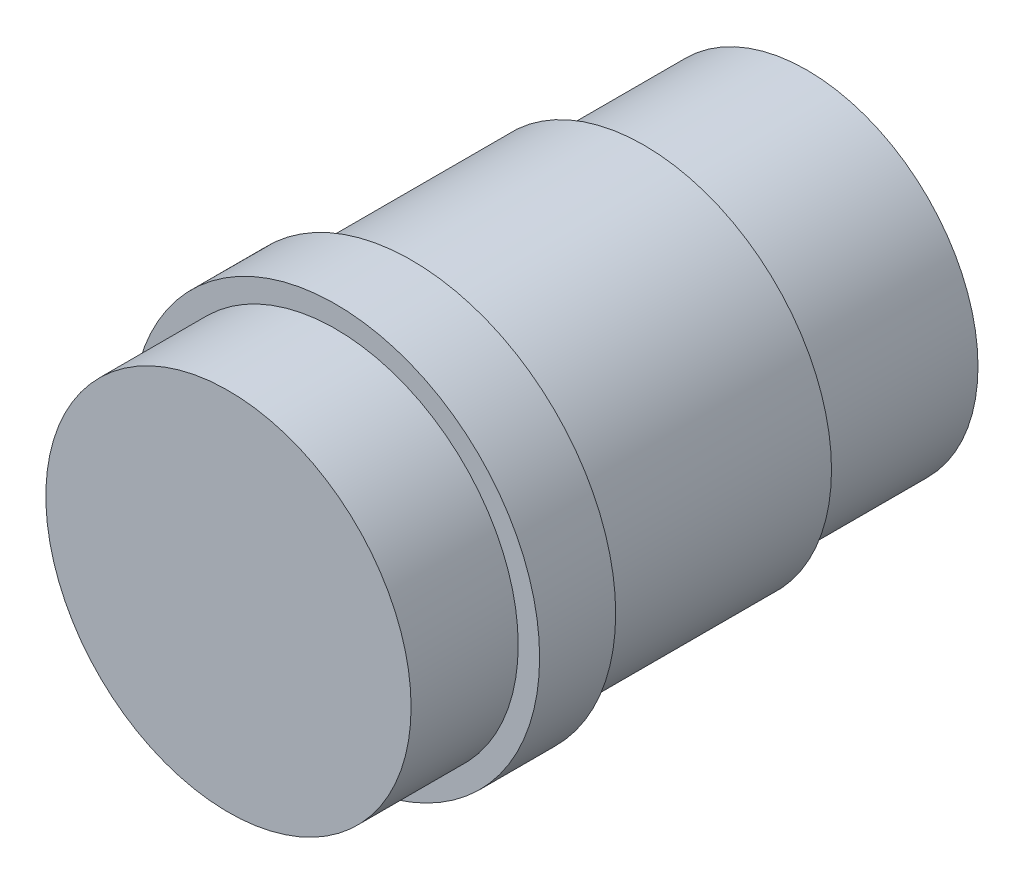
ISO-10303-21;
HEADER;
FILE_DESCRIPTION(('STEP AP214'),'2;1');
FILE_NAME('part.step','',(''),(''),'','','');
FILE_SCHEMA(('AUTOMOTIVE_DESIGN { 1 0 10303 214 1 1 1 1 }'));
ENDSEC;
DATA;
#1=APPLICATION_CONTEXT('core data for automotive mechanical design processes');
#2=APPLICATION_PROTOCOL_DEFINITION('international standard','automotive_design',2000,#1);
#3=PRODUCT_CONTEXT('',#1,'mechanical');
#4=PRODUCT('Part','Part','',(#3));
#5=PRODUCT_RELATED_PRODUCT_CATEGORY('part','',(#4));
#6=PRODUCT_DEFINITION_FORMATION('','',#4);
#7=PRODUCT_DEFINITION_CONTEXT('part definition',#1,'design');
#8=PRODUCT_DEFINITION('design','',#6,#7);
#9=PRODUCT_DEFINITION_SHAPE('','',#8);
#10=(LENGTH_UNIT() NAMED_UNIT(*) SI_UNIT(.MILLI.,.METRE.));
#11=(NAMED_UNIT(*) PLANE_ANGLE_UNIT() SI_UNIT($,.RADIAN.));
#12=(NAMED_UNIT(*) SI_UNIT($,.STERADIAN.) SOLID_ANGLE_UNIT());
#13=UNCERTAINTY_MEASURE_WITH_UNIT(LENGTH_MEASURE(1.E-05),#10,'distance_accuracy_value','');
#14=(GEOMETRIC_REPRESENTATION_CONTEXT(3) GLOBAL_UNCERTAINTY_ASSIGNED_CONTEXT((#13)) GLOBAL_UNIT_ASSIGNED_CONTEXT((#10,
#11,#12)) REPRESENTATION_CONTEXT('',''));
#15=CARTESIAN_POINT('',(0.,0.,0.));
#16=DIRECTION('',(0.,0.,1.));
#17=DIRECTION('',(1.,0.,0.));
#18=AXIS2_PLACEMENT_3D('',#15,#16,#17);
#19=CARTESIAN_POINT('',(0.,8.525,0.));
#20=DIRECTION('',(0.,0.,-1.));
#21=DIRECTION('',(-1.,0.,0.));
#22=AXIS2_PLACEMENT_3D('',#19,#20,#21);
#23=PLANE('',#22);
#24=CARTESIAN_POINT('',(0.,0.,0.));
#25=DIRECTION('',(0.,0.,1.));
#26=DIRECTION('',(1.,0.,0.));
#27=AXIS2_PLACEMENT_3D('',#24,#25,#26);
#28=CIRCLE('',#27,8.525);
#29=CARTESIAN_POINT('',(8.525,0.,0.));
#30=VERTEX_POINT('',#29);
#31=EDGE_CURVE('E60',#30,#30,#28,.T.);
#32=ORIENTED_EDGE('',*,*,#31,.T.);
#33=EDGE_LOOP('',(#32));
#34=FACE_BOUND('',#33,.T.);
#35=ADVANCED_FACE('F32',(#34),#23,.F.);
#36=CARTESIAN_POINT('',(0.,7.9883,-27.));
#37=DIRECTION('',(0.,0.,1.));
#38=DIRECTION('',(1.,0.,0.));
#39=AXIS2_PLACEMENT_3D('',#36,#37,#38);
#40=PLANE('',#39);
#41=CARTESIAN_POINT('',(0.,0.,-27.));
#42=DIRECTION('',(0.,0.,1.));
#43=DIRECTION('',(1.,0.,0.));
#44=AXIS2_PLACEMENT_3D('',#41,#42,#43);
#45=CIRCLE('',#44,7.9883);
#46=CARTESIAN_POINT('',(7.9883,0.,-27.));
#47=VERTEX_POINT('',#46);
#48=EDGE_CURVE('E10',#47,#47,#45,.T.);
#49=ORIENTED_EDGE('',*,*,#48,.F.);
#50=EDGE_LOOP('',(#49));
#51=FACE_BOUND('',#50,.T.);
#52=ADVANCED_FACE('F102',(#51),#40,.F.);
#53=CARTESIAN_POINT('',(0.,0.,0.));
#54=DIRECTION('',(0.,0.,1.));
#55=DIRECTION('',(1.,0.,0.));
#56=AXIS2_PLACEMENT_3D('',#53,#54,#55);
#57=CYLINDRICAL_SURFACE('',#56,7.9883);
#58=CARTESIAN_POINT('',(0.,0.,-19.4));
#59=DIRECTION('',(0.,0.,1.));
#60=DIRECTION('',(1.,0.,0.));
#61=AXIS2_PLACEMENT_3D('',#58,#59,#60);
#62=CIRCLE('',#61,7.9883);
#63=CARTESIAN_POINT('',(7.9883,0.,-19.4));
#64=VERTEX_POINT('',#63);
#65=EDGE_CURVE('E38',#64,#64,#62,.T.);
#66=ORIENTED_EDGE('',*,*,#65,.F.);
#67=EDGE_LOOP('',(#66));
#68=FACE_BOUND('',#67,.T.);
#69=ORIENTED_EDGE('',*,*,#48,.T.);
#70=EDGE_LOOP('',(#69));
#71=FACE_BOUND('',#70,.T.);
#72=ADVANCED_FACE('F97',(#68,#71),#57,.T.);
#73=CARTESIAN_POINT('',(0.,8.75,-19.4));
#74=DIRECTION('',(0.,0.,1.));
#75=DIRECTION('',(1.,0.,0.));
#76=AXIS2_PLACEMENT_3D('',#73,#74,#75);
#77=PLANE('',#76);
#78=CARTESIAN_POINT('',(0.,0.,-19.4));
#79=DIRECTION('',(0.,0.,1.));
#80=DIRECTION('',(1.,0.,0.));
#81=AXIS2_PLACEMENT_3D('',#78,#79,#80);
#82=CIRCLE('',#81,8.75);
#83=CARTESIAN_POINT('',(8.75,0.,-19.4));
#84=VERTEX_POINT('',#83);
#85=EDGE_CURVE('E42',#84,#84,#82,.T.);
#86=ORIENTED_EDGE('',*,*,#85,.F.);
#87=EDGE_LOOP('',(#86));
#88=FACE_BOUND('',#87,.T.);
#89=ORIENTED_EDGE('',*,*,#65,.T.);
#90=EDGE_LOOP('',(#89));
#91=FACE_BOUND('',#90,.T.);
#92=ADVANCED_FACE('F92',(#88,#91),#77,.F.);
#93=CARTESIAN_POINT('',(0.,0.,0.));
#94=DIRECTION('',(0.,0.,1.));
#95=DIRECTION('',(1.,0.,0.));
#96=AXIS2_PLACEMENT_3D('',#93,#94,#95);
#97=CYLINDRICAL_SURFACE('',#96,8.75);
#98=CARTESIAN_POINT('',(0.,0.,-8.55));
#99=DIRECTION('',(0.,0.,1.));
#100=DIRECTION('',(1.,0.,0.));
#101=AXIS2_PLACEMENT_3D('',#98,#99,#100);
#102=CIRCLE('',#101,8.75);
#103=CARTESIAN_POINT('',(8.75,0.,-8.55));
#104=VERTEX_POINT('',#103);
#105=EDGE_CURVE('E46',#104,#104,#102,.T.);
#106=ORIENTED_EDGE('',*,*,#105,.F.);
#107=EDGE_LOOP('',(#106));
#108=FACE_BOUND('',#107,.T.);
#109=ORIENTED_EDGE('',*,*,#85,.T.);
#110=EDGE_LOOP('',(#109));
#111=FACE_BOUND('',#110,.T.);
#112=ADVANCED_FACE('F86',(#108,#111),#97,.T.);
#113=CARTESIAN_POINT('',(0.,9.525,-8.55));
#114=DIRECTION('',(0.,0.,1.));
#115=DIRECTION('',(1.,0.,0.));
#116=AXIS2_PLACEMENT_3D('',#113,#114,#115);
#117=PLANE('',#116);
#118=CARTESIAN_POINT('',(0.,0.,-8.55));
#119=DIRECTION('',(0.,0.,1.));
#120=DIRECTION('',(1.,0.,0.));
#121=AXIS2_PLACEMENT_3D('',#118,#119,#120);
#122=CIRCLE('',#121,9.525);
#123=CARTESIAN_POINT('',(9.525,0.,-8.55));
#124=VERTEX_POINT('',#123);
#125=EDGE_CURVE('E51',#124,#124,#122,.T.);
#126=ORIENTED_EDGE('',*,*,#125,.F.);
#127=EDGE_LOOP('',(#126));
#128=FACE_BOUND('',#127,.T.);
#129=ORIENTED_EDGE('',*,*,#105,.T.);
#130=EDGE_LOOP('',(#129));
#131=FACE_BOUND('',#130,.T.);
#132=ADVANCED_FACE('F80',(#128,#131),#117,.F.);
#133=CARTESIAN_POINT('',(0.,0.,0.));
#134=DIRECTION('',(0.,0.,1.));
#135=DIRECTION('',(1.,0.,0.));
#136=AXIS2_PLACEMENT_3D('',#133,#134,#135);
#137=CYLINDRICAL_SURFACE('',#136,9.525);
#138=CARTESIAN_POINT('',(0.,0.,-5.));
#139=DIRECTION('',(0.,0.,1.));
#140=DIRECTION('',(1.,0.,0.));
#141=AXIS2_PLACEMENT_3D('',#138,#139,#140);
#142=CIRCLE('',#141,9.525);
#143=CARTESIAN_POINT('',(9.525,0.,-5.));
#144=VERTEX_POINT('',#143);
#145=EDGE_CURVE('E54',#144,#144,#142,.T.);
#146=ORIENTED_EDGE('',*,*,#145,.F.);
#147=EDGE_LOOP('',(#146));
#148=FACE_BOUND('',#147,.T.);
#149=ORIENTED_EDGE('',*,*,#125,.T.);
#150=EDGE_LOOP('',(#149));
#151=FACE_BOUND('',#150,.T.);
#152=ADVANCED_FACE('F74',(#148,#151),#137,.T.);
#153=CARTESIAN_POINT('',(0.,9.525,-5.));
#154=DIRECTION('',(0.,0.,-1.));
#155=DIRECTION('',(-1.,0.,0.));
#156=AXIS2_PLACEMENT_3D('',#153,#154,#155);
#157=PLANE('',#156);
#158=CARTESIAN_POINT('',(0.,0.,-5.));
#159=DIRECTION('',(0.,0.,1.));
#160=DIRECTION('',(1.,0.,0.));
#161=AXIS2_PLACEMENT_3D('',#158,#159,#160);
#162=CIRCLE('',#161,8.525);
#163=CARTESIAN_POINT('',(8.525,0.,-5.));
#164=VERTEX_POINT('',#163);
#165=EDGE_CURVE('E57',#164,#164,#162,.T.);
#166=ORIENTED_EDGE('',*,*,#165,.F.);
#167=EDGE_LOOP('',(#166));
#168=FACE_BOUND('',#167,.T.);
#169=ORIENTED_EDGE('',*,*,#145,.T.);
#170=EDGE_LOOP('',(#169));
#171=FACE_BOUND('',#170,.T.);
#172=ADVANCED_FACE('F68',(#168,#171),#157,.F.);
#173=CARTESIAN_POINT('',(0.,0.,0.));
#174=DIRECTION('',(0.,0.,1.));
#175=DIRECTION('',(1.,0.,0.));
#176=AXIS2_PLACEMENT_3D('',#173,#174,#175);
#177=CYLINDRICAL_SURFACE('',#176,8.525);
#178=ORIENTED_EDGE('',*,*,#31,.F.);
#179=EDGE_LOOP('',(#178));
#180=FACE_BOUND('',#179,.T.);
#181=ORIENTED_EDGE('',*,*,#165,.T.);
#182=EDGE_LOOP('',(#181));
#183=FACE_BOUND('',#182,.T.);
#184=ADVANCED_FACE('F65',(#180,#183),#177,.T.);
#185=CLOSED_SHELL('',(#35,#52,#72,#92,#112,#132,#152,#172,#184));
#186=MANIFOLD_SOLID_BREP('B2',#185);
#187=ADVANCED_BREP_SHAPE_REPRESENTATION('',(#18,#186),#14);
#188=SHAPE_DEFINITION_REPRESENTATION(#9,#187);
ENDSEC;
END-ISO-10303-21;
